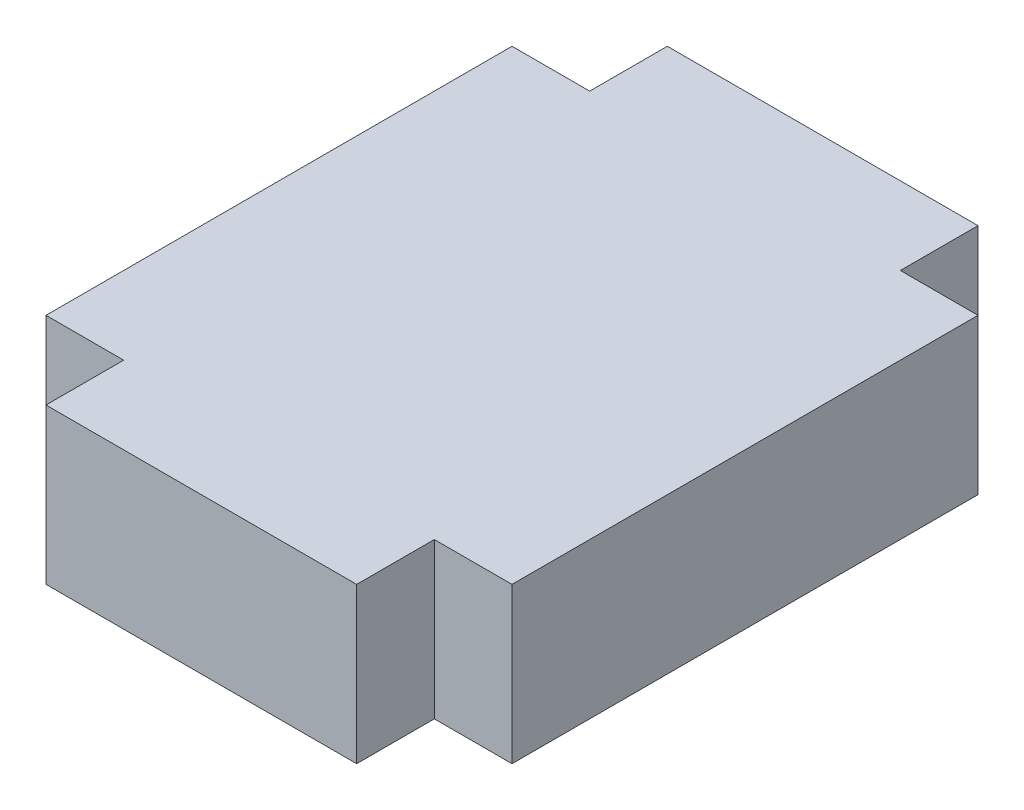
ISO-10303-21;
HEADER;
FILE_DESCRIPTION(('STEP AP214'),'2;1');
FILE_NAME('part.step','',(''),(''),'','','');
FILE_SCHEMA(('AUTOMOTIVE_DESIGN { 1 0 10303 214 1 1 1 1 }'));
ENDSEC;
DATA;
#1=APPLICATION_CONTEXT('core data for automotive mechanical design processes');
#2=APPLICATION_PROTOCOL_DEFINITION('international standard','automotive_design',2000,#1);
#3=PRODUCT_CONTEXT('',#1,'mechanical');
#4=PRODUCT('Part','Part','',(#3));
#5=PRODUCT_RELATED_PRODUCT_CATEGORY('part','',(#4));
#6=PRODUCT_DEFINITION_FORMATION('','',#4);
#7=PRODUCT_DEFINITION_CONTEXT('part definition',#1,'design');
#8=PRODUCT_DEFINITION('design','',#6,#7);
#9=PRODUCT_DEFINITION_SHAPE('','',#8);
#10=(LENGTH_UNIT() NAMED_UNIT(*) SI_UNIT(.MILLI.,.METRE.));
#11=(NAMED_UNIT(*) PLANE_ANGLE_UNIT() SI_UNIT($,.RADIAN.));
#12=(NAMED_UNIT(*) SI_UNIT($,.STERADIAN.) SOLID_ANGLE_UNIT());
#13=UNCERTAINTY_MEASURE_WITH_UNIT(LENGTH_MEASURE(1.E-05),#10,'distance_accuracy_value','');
#14=(GEOMETRIC_REPRESENTATION_CONTEXT(3) GLOBAL_UNCERTAINTY_ASSIGNED_CONTEXT((#13)) GLOBAL_UNIT_ASSIGNED_CONTEXT((#10,
#11,#12)) REPRESENTATION_CONTEXT('',''));
#15=CARTESIAN_POINT('',(0.,0.,0.));
#16=DIRECTION('',(0.,0.,1.));
#17=DIRECTION('',(1.,0.,0.));
#18=AXIS2_PLACEMENT_3D('',#15,#16,#17);
#19=CARTESIAN_POINT('',(0.,0.,0.));
#20=DIRECTION('',(0.,-1.,0.));
#21=DIRECTION('',(0.,0.,-1.));
#22=AXIS2_PLACEMENT_3D('',#19,#20,#21);
#23=PLANE('',#22);
#24=DIRECTION('',(0.,0.,1.));
#25=VECTOR('',#24,1.);
#26=CARTESIAN_POINT('',(0.,0.,0.));
#27=LINE('',#26,#25);
#28=CARTESIAN_POINT('',(0.,0.,-6.));
#29=VERTEX_POINT('',#28);
#30=CARTESIAN_POINT('',(0.,0.,0.));
#31=VERTEX_POINT('',#30);
#32=EDGE_CURVE('E197',#29,#31,#27,.T.);
#33=ORIENTED_EDGE('',*,*,#32,.F.);
#34=DIRECTION('',(-1.,0.,0.));
#35=VECTOR('',#34,1.);
#36=CARTESIAN_POINT('',(0.,0.,-6.));
#37=LINE('',#36,#35);
#38=CARTESIAN_POINT('',(1.,0.,-6.));
#39=VERTEX_POINT('',#38);
#40=EDGE_CURVE('E27',#39,#29,#37,.T.);
#41=ORIENTED_EDGE('',*,*,#40,.F.);
#42=DIRECTION('',(0.,0.,1.));
#43=VECTOR('',#42,1.);
#44=CARTESIAN_POINT('',(1.,0.,-7.));
#45=LINE('',#44,#43);
#46=CARTESIAN_POINT('',(1.,0.,-7.));
#47=VERTEX_POINT('',#46);
#48=EDGE_CURVE('E243',#47,#39,#45,.T.);
#49=ORIENTED_EDGE('',*,*,#48,.F.);
#50=DIRECTION('',(-1.,0.,0.));
#51=VECTOR('',#50,1.);
#52=CARTESIAN_POINT('',(5.,0.,-7.));
#53=LINE('',#52,#51);
#54=CARTESIAN_POINT('',(5.,0.,-7.));
#55=VERTEX_POINT('',#54);
#56=EDGE_CURVE('E129',#55,#47,#53,.T.);
#57=ORIENTED_EDGE('',*,*,#56,.F.);
#58=DIRECTION('',(0.,0.,-1.));
#59=VECTOR('',#58,1.);
#60=CARTESIAN_POINT('',(5.,0.,-7.));
#61=LINE('',#60,#59);
#62=CARTESIAN_POINT('',(5.,0.,-6.));
#63=VERTEX_POINT('',#62);
#64=EDGE_CURVE('E160',#63,#55,#61,.T.);
#65=ORIENTED_EDGE('',*,*,#64,.F.);
#66=DIRECTION('',(-1.,0.,0.));
#67=VECTOR('',#66,1.);
#68=CARTESIAN_POINT('',(5.,0.,-6.));
#69=LINE('',#68,#67);
#70=CARTESIAN_POINT('',(6.,0.,-6.));
#71=VERTEX_POINT('',#70);
#72=EDGE_CURVE('E163',#71,#63,#69,.T.);
#73=ORIENTED_EDGE('',*,*,#72,.F.);
#74=DIRECTION('',(0.,0.,-1.));
#75=VECTOR('',#74,1.);
#76=CARTESIAN_POINT('',(6.,0.,0.));
#77=LINE('',#76,#75);
#78=CARTESIAN_POINT('',(6.,0.,0.));
#79=VERTEX_POINT('',#78);
#80=EDGE_CURVE('E174',#79,#71,#77,.T.);
#81=ORIENTED_EDGE('',*,*,#80,.F.);
#82=DIRECTION('',(1.,0.,0.));
#83=VECTOR('',#82,1.);
#84=CARTESIAN_POINT('',(5.,0.,0.));
#85=LINE('',#84,#83);
#86=CARTESIAN_POINT('',(5.,0.,0.));
#87=VERTEX_POINT('',#86);
#88=EDGE_CURVE('E219',#87,#79,#85,.T.);
#89=ORIENTED_EDGE('',*,*,#88,.F.);
#90=DIRECTION('',(0.,0.,-1.));
#91=VECTOR('',#90,1.);
#92=CARTESIAN_POINT('',(5.,0.,0.));
#93=LINE('',#92,#91);
#94=CARTESIAN_POINT('',(5.,0.,1.));
#95=VERTEX_POINT('',#94);
#96=EDGE_CURVE('E208',#95,#87,#93,.T.);
#97=ORIENTED_EDGE('',*,*,#96,.F.);
#98=DIRECTION('',(1.,0.,0.));
#99=VECTOR('',#98,1.);
#100=CARTESIAN_POINT('',(5.,0.,1.));
#101=LINE('',#100,#99);
#102=CARTESIAN_POINT('',(1.,0.,1.));
#103=VERTEX_POINT('',#102);
#104=EDGE_CURVE('E181',#103,#95,#101,.T.);
#105=ORIENTED_EDGE('',*,*,#104,.F.);
#106=DIRECTION('',(0.,0.,1.));
#107=VECTOR('',#106,1.);
#108=CARTESIAN_POINT('',(1.,0.,0.));
#109=LINE('',#108,#107);
#110=CARTESIAN_POINT('',(1.,0.,0.));
#111=VERTEX_POINT('',#110);
#112=EDGE_CURVE('E230',#111,#103,#109,.T.);
#113=ORIENTED_EDGE('',*,*,#112,.F.);
#114=DIRECTION('',(1.,0.,0.));
#115=VECTOR('',#114,1.);
#116=CARTESIAN_POINT('',(0.,0.,0.));
#117=LINE('',#116,#115);
#118=EDGE_CURVE('E87',#31,#111,#117,.T.);
#119=ORIENTED_EDGE('',*,*,#118,.F.);
#120=EDGE_LOOP('',(#33,#41,#49,#57,#65,#73,#81,#89,#97,#105,#113,#119));
#121=FACE_BOUND('',#120,.T.);
#122=ADVANCED_FACE('F16',(#121),#23,.T.);
#123=CARTESIAN_POINT('',(0.,2.,0.));
#124=DIRECTION('',(0.,-1.,0.));
#125=DIRECTION('',(0.,0.,-1.));
#126=AXIS2_PLACEMENT_3D('',#123,#124,#125);
#127=PLANE('',#126);
#128=DIRECTION('',(0.,0.,1.));
#129=VECTOR('',#128,1.);
#130=CARTESIAN_POINT('',(0.,2.,0.));
#131=LINE('',#130,#129);
#132=CARTESIAN_POINT('',(0.,2.,-6.));
#133=VERTEX_POINT('',#132);
#134=CARTESIAN_POINT('',(0.,2.,0.));
#135=VERTEX_POINT('',#134);
#136=EDGE_CURVE('E196',#133,#135,#131,.T.);
#137=ORIENTED_EDGE('',*,*,#136,.T.);
#138=DIRECTION('',(1.,0.,0.));
#139=VECTOR('',#138,1.);
#140=CARTESIAN_POINT('',(0.,2.,0.));
#141=LINE('',#140,#139);
#142=CARTESIAN_POINT('',(1.,2.,0.));
#143=VERTEX_POINT('',#142);
#144=EDGE_CURVE('E226',#135,#143,#141,.T.);
#145=ORIENTED_EDGE('',*,*,#144,.T.);
#146=DIRECTION('',(0.,0.,1.));
#147=VECTOR('',#146,1.);
#148=CARTESIAN_POINT('',(1.,2.,0.));
#149=LINE('',#148,#147);
#150=CARTESIAN_POINT('',(1.,2.,1.));
#151=VERTEX_POINT('',#150);
#152=EDGE_CURVE('E188',#143,#151,#149,.T.);
#153=ORIENTED_EDGE('',*,*,#152,.T.);
#154=DIRECTION('',(1.,0.,0.));
#155=VECTOR('',#154,1.);
#156=CARTESIAN_POINT('',(5.,2.,1.));
#157=LINE('',#156,#155);
#158=CARTESIAN_POINT('',(5.,2.,1.));
#159=VERTEX_POINT('',#158);
#160=EDGE_CURVE('E180',#151,#159,#157,.T.);
#161=ORIENTED_EDGE('',*,*,#160,.T.);
#162=DIRECTION('',(0.,0.,-1.));
#163=VECTOR('',#162,1.);
#164=CARTESIAN_POINT('',(5.,2.,0.));
#165=LINE('',#164,#163);
#166=CARTESIAN_POINT('',(5.,2.,0.));
#167=VERTEX_POINT('',#166);
#168=EDGE_CURVE('E20',#159,#167,#165,.T.);
#169=ORIENTED_EDGE('',*,*,#168,.T.);
#170=DIRECTION('',(1.,0.,0.));
#171=VECTOR('',#170,1.);
#172=CARTESIAN_POINT('',(5.,2.,0.));
#173=LINE('',#172,#171);
#174=CARTESIAN_POINT('',(6.,2.,0.));
#175=VERTEX_POINT('',#174);
#176=EDGE_CURVE('E171',#167,#175,#173,.T.);
#177=ORIENTED_EDGE('',*,*,#176,.T.);
#178=DIRECTION('',(0.,0.,-1.));
#179=VECTOR('',#178,1.);
#180=CARTESIAN_POINT('',(6.,2.,0.));
#181=LINE('',#180,#179);
#182=CARTESIAN_POINT('',(6.,2.,-6.));
#183=VERTEX_POINT('',#182);
#184=EDGE_CURVE('E155',#175,#183,#181,.T.);
#185=ORIENTED_EDGE('',*,*,#184,.T.);
#186=DIRECTION('',(-1.,0.,0.));
#187=VECTOR('',#186,1.);
#188=CARTESIAN_POINT('',(5.,2.,-6.));
#189=LINE('',#188,#187);
#190=CARTESIAN_POINT('',(5.,2.,-6.));
#191=VERTEX_POINT('',#190);
#192=EDGE_CURVE('E151',#183,#191,#189,.T.);
#193=ORIENTED_EDGE('',*,*,#192,.T.);
#194=DIRECTION('',(0.,0.,-1.));
#195=VECTOR('',#194,1.);
#196=CARTESIAN_POINT('',(5.,2.,-7.));
#197=LINE('',#196,#195);
#198=CARTESIAN_POINT('',(5.,2.,-7.));
#199=VERTEX_POINT('',#198);
#200=EDGE_CURVE('E137',#191,#199,#197,.T.);
#201=ORIENTED_EDGE('',*,*,#200,.T.);
#202=DIRECTION('',(-1.,0.,0.));
#203=VECTOR('',#202,1.);
#204=CARTESIAN_POINT('',(5.,2.,-7.));
#205=LINE('',#204,#203);
#206=CARTESIAN_POINT('',(1.,2.,-7.));
#207=VERTEX_POINT('',#206);
#208=EDGE_CURVE('E247',#199,#207,#205,.T.);
#209=ORIENTED_EDGE('',*,*,#208,.T.);
#210=DIRECTION('',(0.,0.,1.));
#211=VECTOR('',#210,1.);
#212=CARTESIAN_POINT('',(1.,2.,-7.));
#213=LINE('',#212,#211);
#214=CARTESIAN_POINT('',(1.,2.,-6.));
#215=VERTEX_POINT('',#214);
#216=EDGE_CURVE('E215',#207,#215,#213,.T.);
#217=ORIENTED_EDGE('',*,*,#216,.T.);
#218=DIRECTION('',(-1.,0.,0.));
#219=VECTOR('',#218,1.);
#220=CARTESIAN_POINT('',(0.,2.,-6.));
#221=LINE('',#220,#219);
#222=EDGE_CURVE('E11',#215,#133,#221,.T.);
#223=ORIENTED_EDGE('',*,*,#222,.T.);
#224=EDGE_LOOP('',(#137,#145,#153,#161,#169,#177,#185,#193,#201,#209,#217,#223));
#225=FACE_BOUND('',#224,.T.);
#226=ADVANCED_FACE('F153',(#225),#127,.F.);
#227=CARTESIAN_POINT('',(0.,2.,-6.));
#228=DIRECTION('',(0.,0.,1.));
#229=DIRECTION('',(1.,0.,0.));
#230=AXIS2_PLACEMENT_3D('',#227,#228,#229);
#231=PLANE('',#230);
#232=ORIENTED_EDGE('',*,*,#40,.T.);
#233=DIRECTION('',(0.,-1.,0.));
#234=VECTOR('',#233,1.);
#235=CARTESIAN_POINT('',(0.,2.,-6.));
#236=LINE('',#235,#234);
#237=EDGE_CURVE('E202',#133,#29,#236,.T.);
#238=ORIENTED_EDGE('',*,*,#237,.F.);
#239=ORIENTED_EDGE('',*,*,#222,.F.);
#240=DIRECTION('',(0.,-1.,0.));
#241=VECTOR('',#240,1.);
#242=CARTESIAN_POINT('',(1.,2.,-6.));
#243=LINE('',#242,#241);
#244=EDGE_CURVE('E240',#215,#39,#243,.T.);
#245=ORIENTED_EDGE('',*,*,#244,.T.);
#246=EDGE_LOOP('',(#232,#238,#239,#245));
#247=FACE_BOUND('',#246,.T.);
#248=ADVANCED_FACE('F284',(#247),#231,.F.);
#249=CARTESIAN_POINT('',(1.,2.,-7.));
#250=DIRECTION('',(1.,0.,0.));
#251=DIRECTION('',(0.,0.,1.));
#252=AXIS2_PLACEMENT_3D('',#249,#250,#251);
#253=PLANE('',#252);
#254=ORIENTED_EDGE('',*,*,#48,.T.);
#255=ORIENTED_EDGE('',*,*,#244,.F.);
#256=ORIENTED_EDGE('',*,*,#216,.F.);
#257=DIRECTION('',(0.,-1.,0.));
#258=VECTOR('',#257,1.);
#259=CARTESIAN_POINT('',(1.,2.,-7.));
#260=LINE('',#259,#258);
#261=EDGE_CURVE('E221',#207,#47,#260,.T.);
#262=ORIENTED_EDGE('',*,*,#261,.T.);
#263=EDGE_LOOP('',(#254,#255,#256,#262));
#264=FACE_BOUND('',#263,.T.);
#265=ADVANCED_FACE('F286',(#264),#253,.F.);
#266=CARTESIAN_POINT('',(5.,2.,-7.));
#267=DIRECTION('',(0.,0.,1.));
#268=DIRECTION('',(1.,0.,0.));
#269=AXIS2_PLACEMENT_3D('',#266,#267,#268);
#270=PLANE('',#269);
#271=ORIENTED_EDGE('',*,*,#56,.T.);
#272=ORIENTED_EDGE('',*,*,#261,.F.);
#273=ORIENTED_EDGE('',*,*,#208,.F.);
#274=DIRECTION('',(0.,-1.,0.));
#275=VECTOR('',#274,1.);
#276=CARTESIAN_POINT('',(5.,2.,-7.));
#277=LINE('',#276,#275);
#278=EDGE_CURVE('E144',#199,#55,#277,.T.);
#279=ORIENTED_EDGE('',*,*,#278,.T.);
#280=EDGE_LOOP('',(#271,#272,#273,#279));
#281=FACE_BOUND('',#280,.T.);
#282=ADVANCED_FACE('F289',(#281),#270,.F.);
#283=CARTESIAN_POINT('',(5.,2.,-7.));
#284=DIRECTION('',(-1.,0.,0.));
#285=DIRECTION('',(0.,0.,1.));
#286=AXIS2_PLACEMENT_3D('',#283,#284,#285);
#287=PLANE('',#286);
#288=ORIENTED_EDGE('',*,*,#64,.T.);
#289=ORIENTED_EDGE('',*,*,#278,.F.);
#290=ORIENTED_EDGE('',*,*,#200,.F.);
#291=DIRECTION('',(0.,-1.,0.));
#292=VECTOR('',#291,1.);
#293=CARTESIAN_POINT('',(5.,2.,-6.));
#294=LINE('',#293,#292);
#295=EDGE_CURVE('E142',#191,#63,#294,.T.);
#296=ORIENTED_EDGE('',*,*,#295,.T.);
#297=EDGE_LOOP('',(#288,#289,#290,#296));
#298=FACE_BOUND('',#297,.T.);
#299=ADVANCED_FACE('F140',(#298),#287,.F.);
#300=CARTESIAN_POINT('',(5.,2.,-6.));
#301=DIRECTION('',(0.,0.,1.));
#302=DIRECTION('',(1.,0.,0.));
#303=AXIS2_PLACEMENT_3D('',#300,#301,#302);
#304=PLANE('',#303);
#305=ORIENTED_EDGE('',*,*,#72,.T.);
#306=ORIENTED_EDGE('',*,*,#295,.F.);
#307=ORIENTED_EDGE('',*,*,#192,.F.);
#308=DIRECTION('',(0.,-1.,0.));
#309=VECTOR('',#308,1.);
#310=CARTESIAN_POINT('',(6.,2.,-6.));
#311=LINE('',#310,#309);
#312=EDGE_CURVE('E184',#183,#71,#311,.T.);
#313=ORIENTED_EDGE('',*,*,#312,.T.);
#314=EDGE_LOOP('',(#305,#306,#307,#313));
#315=FACE_BOUND('',#314,.T.);
#316=ADVANCED_FACE('F162',(#315),#304,.F.);
#317=CARTESIAN_POINT('',(6.,2.,0.));
#318=DIRECTION('',(-1.,0.,0.));
#319=DIRECTION('',(0.,0.,1.));
#320=AXIS2_PLACEMENT_3D('',#317,#318,#319);
#321=PLANE('',#320);
#322=ORIENTED_EDGE('',*,*,#80,.T.);
#323=ORIENTED_EDGE('',*,*,#312,.F.);
#324=ORIENTED_EDGE('',*,*,#184,.F.);
#325=DIRECTION('',(0.,-1.,0.));
#326=VECTOR('',#325,1.);
#327=CARTESIAN_POINT('',(6.,2.,0.));
#328=LINE('',#327,#326);
#329=EDGE_CURVE('E175',#175,#79,#328,.T.);
#330=ORIENTED_EDGE('',*,*,#329,.T.);
#331=EDGE_LOOP('',(#322,#323,#324,#330));
#332=FACE_BOUND('',#331,.T.);
#333=ADVANCED_FACE('F291',(#332),#321,.F.);
#334=CARTESIAN_POINT('',(5.,2.,0.));
#335=DIRECTION('',(0.,0.,-1.));
#336=DIRECTION('',(0.,-1.,0.));
#337=AXIS2_PLACEMENT_3D('',#334,#335,#336);
#338=PLANE('',#337);
#339=ORIENTED_EDGE('',*,*,#88,.T.);
#340=ORIENTED_EDGE('',*,*,#329,.F.);
#341=ORIENTED_EDGE('',*,*,#176,.F.);
#342=DIRECTION('',(0.,-1.,0.));
#343=VECTOR('',#342,1.);
#344=CARTESIAN_POINT('',(5.,2.,0.));
#345=LINE('',#344,#343);
#346=EDGE_CURVE('E212',#167,#87,#345,.T.);
#347=ORIENTED_EDGE('',*,*,#346,.T.);
#348=EDGE_LOOP('',(#339,#340,#341,#347));
#349=FACE_BOUND('',#348,.T.);
#350=ADVANCED_FACE('F294',(#349),#338,.F.);
#351=CARTESIAN_POINT('',(5.,2.,0.));
#352=DIRECTION('',(-1.,0.,0.));
#353=DIRECTION('',(0.,0.,1.));
#354=AXIS2_PLACEMENT_3D('',#351,#352,#353);
#355=PLANE('',#354);
#356=ORIENTED_EDGE('',*,*,#96,.T.);
#357=ORIENTED_EDGE('',*,*,#346,.F.);
#358=ORIENTED_EDGE('',*,*,#168,.F.);
#359=DIRECTION('',(0.,-1.,0.));
#360=VECTOR('',#359,1.);
#361=CARTESIAN_POINT('',(5.,2.,1.));
#362=LINE('',#361,#360);
#363=EDGE_CURVE('E176',#159,#95,#362,.T.);
#364=ORIENTED_EDGE('',*,*,#363,.T.);
#365=EDGE_LOOP('',(#356,#357,#358,#364));
#366=FACE_BOUND('',#365,.T.);
#367=ADVANCED_FACE('F298',(#366),#355,.F.);
#368=CARTESIAN_POINT('',(5.,2.,1.));
#369=DIRECTION('',(0.,0.,-1.));
#370=DIRECTION('',(0.,-1.,0.));
#371=AXIS2_PLACEMENT_3D('',#368,#369,#370);
#372=PLANE('',#371);
#373=ORIENTED_EDGE('',*,*,#104,.T.);
#374=ORIENTED_EDGE('',*,*,#363,.F.);
#375=ORIENTED_EDGE('',*,*,#160,.F.);
#376=DIRECTION('',(0.,-1.,0.));
#377=VECTOR('',#376,1.);
#378=CARTESIAN_POINT('',(1.,2.,1.));
#379=LINE('',#378,#377);
#380=EDGE_CURVE('E192',#151,#103,#379,.T.);
#381=ORIENTED_EDGE('',*,*,#380,.T.);
#382=EDGE_LOOP('',(#373,#374,#375,#381));
#383=FACE_BOUND('',#382,.T.);
#384=ADVANCED_FACE('F18',(#383),#372,.F.);
#385=CARTESIAN_POINT('',(1.,2.,0.));
#386=DIRECTION('',(1.,0.,0.));
#387=DIRECTION('',(0.,0.,1.));
#388=AXIS2_PLACEMENT_3D('',#385,#386,#387);
#389=PLANE('',#388);
#390=ORIENTED_EDGE('',*,*,#112,.T.);
#391=ORIENTED_EDGE('',*,*,#380,.F.);
#392=ORIENTED_EDGE('',*,*,#152,.F.);
#393=DIRECTION('',(0.,-1.,0.));
#394=VECTOR('',#393,1.);
#395=CARTESIAN_POINT('',(1.,2.,0.));
#396=LINE('',#395,#394);
#397=EDGE_CURVE('E231',#143,#111,#396,.T.);
#398=ORIENTED_EDGE('',*,*,#397,.T.);
#399=EDGE_LOOP('',(#390,#391,#392,#398));
#400=FACE_BOUND('',#399,.T.);
#401=ADVANCED_FACE('F275',(#400),#389,.F.);
#402=CARTESIAN_POINT('',(0.,2.,0.));
#403=DIRECTION('',(0.,0.,-1.));
#404=DIRECTION('',(0.,-1.,0.));
#405=AXIS2_PLACEMENT_3D('',#402,#403,#404);
#406=PLANE('',#405);
#407=ORIENTED_EDGE('',*,*,#118,.T.);
#408=ORIENTED_EDGE('',*,*,#397,.F.);
#409=ORIENTED_EDGE('',*,*,#144,.F.);
#410=DIRECTION('',(0.,-1.,0.));
#411=VECTOR('',#410,1.);
#412=CARTESIAN_POINT('',(0.,2.,0.));
#413=LINE('',#412,#411);
#414=EDGE_CURVE('E193',#135,#31,#413,.T.);
#415=ORIENTED_EDGE('',*,*,#414,.T.);
#416=EDGE_LOOP('',(#407,#408,#409,#415));
#417=FACE_BOUND('',#416,.T.);
#418=ADVANCED_FACE('F278',(#417),#406,.F.);
#419=CARTESIAN_POINT('',(0.,2.,0.));
#420=DIRECTION('',(1.,0.,0.));
#421=DIRECTION('',(0.,1.,0.));
#422=AXIS2_PLACEMENT_3D('',#419,#420,#421);
#423=PLANE('',#422);
#424=ORIENTED_EDGE('',*,*,#32,.T.);
#425=ORIENTED_EDGE('',*,*,#414,.F.);
#426=ORIENTED_EDGE('',*,*,#136,.F.);
#427=ORIENTED_EDGE('',*,*,#237,.T.);
#428=EDGE_LOOP('',(#424,#425,#426,#427));
#429=FACE_BOUND('',#428,.T.);
#430=ADVANCED_FACE('F282',(#429),#423,.F.);
#431=CLOSED_SHELL('',(#122,#226,#248,#265,#282,#299,#316,#333,#350,#367,#384,#401,#418,#430));
#432=MANIFOLD_SOLID_BREP('B1',#431);
#433=ADVANCED_BREP_SHAPE_REPRESENTATION('',(#18,#432),#14);
#434=SHAPE_DEFINITION_REPRESENTATION(#9,#433);
ENDSEC;
END-ISO-10303-21;
